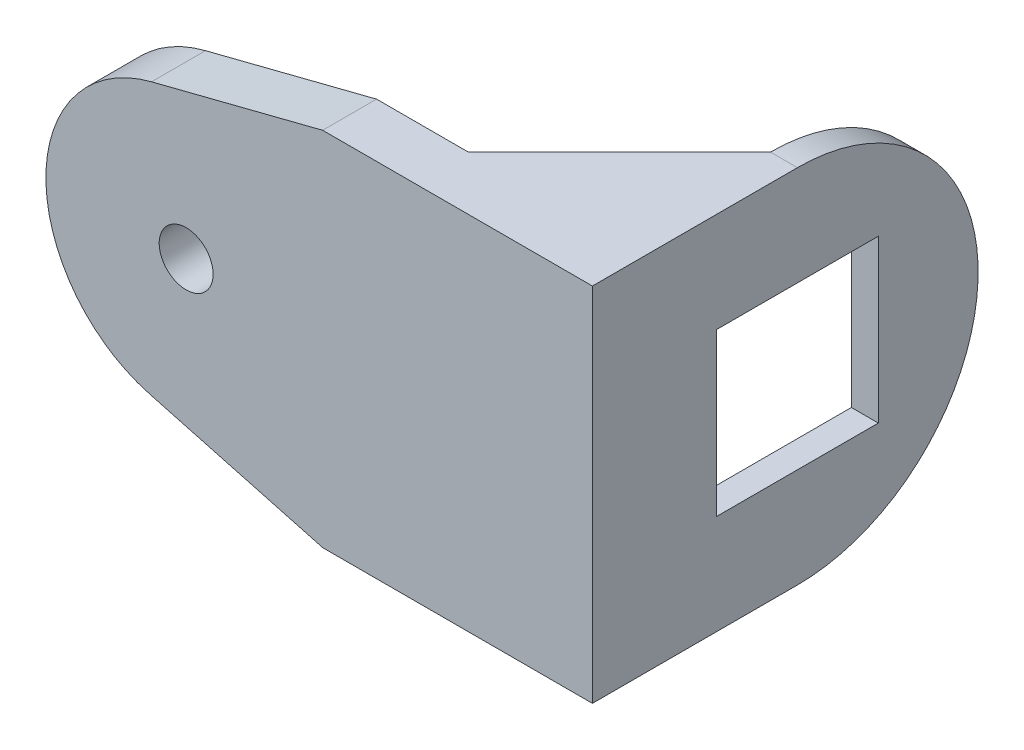
ISO-10303-21;
HEADER;
FILE_DESCRIPTION(('STEP AP214'),'2;1');
FILE_NAME('part.step','',(''),(''),'','','');
FILE_SCHEMA(('AUTOMOTIVE_DESIGN { 1 0 10303 214 1 1 1 1 }'));
ENDSEC;
DATA;
#1=APPLICATION_CONTEXT('core data for automotive mechanical design processes');
#2=APPLICATION_PROTOCOL_DEFINITION('international standard','automotive_design',2000,#1);
#3=PRODUCT_CONTEXT('',#1,'mechanical');
#4=PRODUCT('Part','Part','',(#3));
#5=PRODUCT_RELATED_PRODUCT_CATEGORY('part','',(#4));
#6=PRODUCT_DEFINITION_FORMATION('','',#4);
#7=PRODUCT_DEFINITION_CONTEXT('part definition',#1,'design');
#8=PRODUCT_DEFINITION('design','',#6,#7);
#9=PRODUCT_DEFINITION_SHAPE('','',#8);
#10=(LENGTH_UNIT() NAMED_UNIT(*) SI_UNIT(.MILLI.,.METRE.));
#11=(NAMED_UNIT(*) PLANE_ANGLE_UNIT() SI_UNIT($,.RADIAN.));
#12=(NAMED_UNIT(*) SI_UNIT($,.STERADIAN.) SOLID_ANGLE_UNIT());
#13=UNCERTAINTY_MEASURE_WITH_UNIT(LENGTH_MEASURE(1.E-05),#10,'distance_accuracy_value','');
#14=(GEOMETRIC_REPRESENTATION_CONTEXT(3) GLOBAL_UNCERTAINTY_ASSIGNED_CONTEXT((#13)) GLOBAL_UNIT_ASSIGNED_CONTEXT((#10,
#11,#12)) REPRESENTATION_CONTEXT('',''));
#15=CARTESIAN_POINT('',(0.,0.,0.));
#16=DIRECTION('',(0.,0.,1.));
#17=DIRECTION('',(1.,0.,0.));
#18=AXIS2_PLACEMENT_3D('',#15,#16,#17);
#19=CARTESIAN_POINT('',(0.,0.,0.));
#20=DIRECTION('',(0.,0.,-1.));
#21=DIRECTION('',(-1.,0.,0.));
#22=AXIS2_PLACEMENT_3D('',#19,#20,#21);
#23=PLANE('',#22);
#24=CARTESIAN_POINT('',(0.,0.,0.));
#25=DIRECTION('',(0.,0.,1.));
#26=DIRECTION('',(1.,0.,0.));
#27=AXIS2_PLACEMENT_3D('',#24,#25,#26);
#28=CIRCLE('',#27,5.);
#29=CARTESIAN_POINT('',(5.,0.,0.));
#30=VERTEX_POINT('',#29);
#31=EDGE_CURVE('E256',#30,#30,#28,.T.);
#32=ORIENTED_EDGE('',*,*,#31,.T.);
#33=EDGE_LOOP('',(#32));
#34=FACE_BOUND('',#33,.T.);
#35=DIRECTION('',(-1.,0.,0.));
#36=VECTOR('',#35,1.);
#37=CARTESIAN_POINT('',(25.3048516922266,33.27511008462,0.));
#38=LINE('',#37,#36);
#39=CARTESIAN_POINT('',(42.3048516922262,33.27511008462,0.));
#40=VERTEX_POINT('',#39);
#41=CARTESIAN_POINT('',(25.3048516922266,33.27511008462,0.));
#42=VERTEX_POINT('',#41);
#43=EDGE_CURVE('E68',#40,#42,#38,.T.);
#44=ORIENTED_EDGE('',*,*,#43,.F.);
#45=DIRECTION('',(0.,1.,0.));
#46=VECTOR('',#45,1.);
#47=CARTESIAN_POINT('',(42.3048516922262,28.27511008462,0.));
#48=LINE('',#47,#46);
#49=CARTESIAN_POINT('',(42.3048516922262,28.27511008462,0.));
#50=VERTEX_POINT('',#49);
#51=EDGE_CURVE('E63',#50,#40,#48,.T.);
#52=ORIENTED_EDGE('',*,*,#51,.F.);
#53=DIRECTION('',(-1.,0.,0.));
#54=VECTOR('',#53,1.);
#55=CARTESIAN_POINT('',(42.3048516922262,28.27511008462,0.));
#56=LINE('',#55,#54);
#57=CARTESIAN_POINT('',(70.3048516922265,28.2751100846201,0.));
#58=VERTEX_POINT('',#57);
#59=EDGE_CURVE('E186',#58,#50,#56,.T.);
#60=ORIENTED_EDGE('',*,*,#59,.F.);
#61=DIRECTION('',(0.,1.,0.));
#62=VECTOR('',#61,1.);
#63=CARTESIAN_POINT('',(70.3048516922265,0.,0.));
#64=LINE('',#63,#62);
#65=CARTESIAN_POINT('',(70.3048516922265,-28.72488991538,0.));
#66=VERTEX_POINT('',#65);
#67=EDGE_CURVE('E164',#66,#58,#64,.T.);
#68=ORIENTED_EDGE('',*,*,#67,.F.);
#69=DIRECTION('',(-1.,0.,0.));
#70=VECTOR('',#69,1.);
#71=CARTESIAN_POINT('',(42.3048516922262,-28.72488991538,0.));
#72=LINE('',#71,#70);
#73=CARTESIAN_POINT('',(42.3048516922262,-28.72488991538,0.));
#74=VERTEX_POINT('',#73);
#75=EDGE_CURVE('E203',#66,#74,#72,.T.);
#76=ORIENTED_EDGE('',*,*,#75,.T.);
#77=DIRECTION('',(0.,-1.,0.));
#78=VECTOR('',#77,1.);
#79=CARTESIAN_POINT('',(42.3048516922262,-28.72488991538,0.));
#80=LINE('',#79,#78);
#81=CARTESIAN_POINT('',(42.3048516922262,-33.72488991538,0.));
#82=VERTEX_POINT('',#81);
#83=EDGE_CURVE('E210',#74,#82,#80,.T.);
#84=ORIENTED_EDGE('',*,*,#83,.T.);
#85=DIRECTION('',(1.,0.,0.));
#86=VECTOR('',#85,1.);
#87=CARTESIAN_POINT('',(75.3048516922266,-33.72488991538,0.));
#88=LINE('',#87,#86);
#89=CARTESIAN_POINT('',(25.3048516922266,-33.72488991538,0.));
#90=VERTEX_POINT('',#89);
#91=EDGE_CURVE('E281',#90,#82,#88,.T.);
#92=ORIENTED_EDGE('',*,*,#91,.F.);
#93=DIRECTION('',(0.965719875374785,-0.259586444765727,0.));
#94=VECTOR('',#93,1.);
#95=CARTESIAN_POINT('',(25.3048516922266,-33.72488991538,0.));
#96=LINE('',#95,#94);
#97=CARTESIAN_POINT('',(-6.74924756390891,-25.1087167597444,0.));
#98=VERTEX_POINT('',#97);
#99=EDGE_CURVE('E305',#98,#90,#96,.T.);
#100=ORIENTED_EDGE('',*,*,#99,.F.);
#101=CARTESIAN_POINT('',(0.,0.,0.));
#102=DIRECTION('',(0.,0.,1.));
#103=DIRECTION('',(-1.,0.,0.));
#104=AXIS2_PLACEMENT_3D('',#101,#102,#103);
#105=CIRCLE('',#104,26.);
#106=CARTESIAN_POINT('',(-6.41722716906485,25.1956185766616,0.));
#107=VERTEX_POINT('',#106);
#108=EDGE_CURVE('E302',#107,#98,#105,.T.);
#109=ORIENTED_EDGE('',*,*,#108,.F.);
#110=DIRECTION('',(-0.969062252948524,-0.246816429579418,0.));
#111=VECTOR('',#110,1.);
#112=CARTESIAN_POINT('',(-6.41722716906485,25.1956185766616,0.));
#113=LINE('',#112,#111);
#114=EDGE_CURVE('E299',#42,#107,#113,.T.);
#115=ORIENTED_EDGE('',*,*,#114,.F.);
#116=EDGE_LOOP('',(#44,#52,#60,#68,#76,#84,#92,#100,#109,#115));
#117=FACE_BOUND('',#116,.T.);
#118=ADVANCED_FACE('F47',(#34,#117),#23,.T.);
#119=CARTESIAN_POINT('',(70.3048516922265,0.,0.));
#120=DIRECTION('',(1.,0.,0.));
#121=DIRECTION('',(0.,1.,0.));
#122=AXIS2_PLACEMENT_3D('',#119,#120,#121);
#123=PLANE('',#122);
#124=DIRECTION('',(0.,0.,1.));
#125=VECTOR('',#124,1.);
#126=CARTESIAN_POINT('',(70.3048516922265,-15.22488991538,0.));
#127=LINE('',#126,#125);
#128=CARTESIAN_POINT('',(70.3048516922265,-15.22488991538,-43.));
#129=VERTEX_POINT('',#128);
#130=CARTESIAN_POINT('',(70.3048516922265,-15.22488991538,-13.));
#131=VERTEX_POINT('',#130);
#132=EDGE_CURVE('E222',#129,#131,#127,.T.);
#133=ORIENTED_EDGE('',*,*,#132,.F.);
#134=DIRECTION('',(0.,1.,0.));
#135=VECTOR('',#134,1.);
#136=CARTESIAN_POINT('',(70.3048516922265,0.,-43.));
#137=LINE('',#136,#135);
#138=CARTESIAN_POINT('',(70.3048516922265,14.77511008462,-43.));
#139=VERTEX_POINT('',#138);
#140=EDGE_CURVE('E174',#129,#139,#137,.T.);
#141=ORIENTED_EDGE('',*,*,#140,.T.);
#142=DIRECTION('',(0.,0.,1.));
#143=VECTOR('',#142,1.);
#144=CARTESIAN_POINT('',(70.3048516922265,14.77511008462,0.));
#145=LINE('',#144,#143);
#146=CARTESIAN_POINT('',(70.3048516922265,14.77511008462,-13.));
#147=VERTEX_POINT('',#146);
#148=EDGE_CURVE('E230',#139,#147,#145,.T.);
#149=ORIENTED_EDGE('',*,*,#148,.T.);
#150=DIRECTION('',(0.,1.,0.));
#151=VECTOR('',#150,1.);
#152=CARTESIAN_POINT('',(70.3048516922265,0.,-13.));
#153=LINE('',#152,#151);
#154=EDGE_CURVE('E226',#131,#147,#153,.T.);
#155=ORIENTED_EDGE('',*,*,#154,.F.);
#156=EDGE_LOOP('',(#133,#141,#149,#155));
#157=FACE_BOUND('',#156,.T.);
#158=DIRECTION('',(0.,1.,0.));
#159=VECTOR('',#158,1.);
#160=CARTESIAN_POINT('',(70.3048516922265,28.27511008462,-28.));
#161=LINE('',#160,#159);
#162=CARTESIAN_POINT('',(70.3048516922265,28.2751100846201,-28.));
#163=VERTEX_POINT('',#162);
#164=CARTESIAN_POINT('',(70.3048516922265,33.2751100846201,-28.));
#165=VERTEX_POINT('',#164);
#166=EDGE_CURVE('E177',#163,#165,#161,.T.);
#167=ORIENTED_EDGE('',*,*,#166,.T.);
#168=CARTESIAN_POINT('',(70.3048516922265,-0.224889915379958,-28.));
#169=DIRECTION('',(1.,0.,0.));
#170=DIRECTION('',(0.,1.,0.));
#171=AXIS2_PLACEMENT_3D('',#168,#169,#170);
#172=CIRCLE('',#171,33.5);
#173=CARTESIAN_POINT('',(70.3048516922265,-33.72488991538,-28.));
#174=VERTEX_POINT('',#173);
#175=EDGE_CURVE('E152',#165,#174,#172,.F.);
#176=ORIENTED_EDGE('',*,*,#175,.T.);
#177=DIRECTION('',(0.,-1.,0.));
#178=VECTOR('',#177,1.);
#179=CARTESIAN_POINT('',(70.3048516922265,-28.72488991538,-28.));
#180=LINE('',#179,#178);
#181=CARTESIAN_POINT('',(70.3048516922265,-28.72488991538,-28.));
#182=VERTEX_POINT('',#181);
#183=EDGE_CURVE('E214',#182,#174,#180,.T.);
#184=ORIENTED_EDGE('',*,*,#183,.F.);
#185=DIRECTION('',(0.,0.,1.));
#186=VECTOR('',#185,1.);
#187=CARTESIAN_POINT('',(70.3048516922265,-28.72488991538,0.));
#188=LINE('',#187,#186);
#189=EDGE_CURVE('E200',#182,#66,#188,.T.);
#190=ORIENTED_EDGE('',*,*,#189,.T.);
#191=ORIENTED_EDGE('',*,*,#67,.T.);
#192=DIRECTION('',(0.,0.,1.));
#193=VECTOR('',#192,1.);
#194=CARTESIAN_POINT('',(70.3048516922265,28.27511008462,0.));
#195=LINE('',#194,#193);
#196=EDGE_CURVE('E181',#163,#58,#195,.T.);
#197=ORIENTED_EDGE('',*,*,#196,.F.);
#198=EDGE_LOOP('',(#167,#176,#184,#190,#191,#197));
#199=FACE_BOUND('',#198,.T.);
#200=ADVANCED_FACE('F178',(#157,#199),#123,.F.);
#201=CARTESIAN_POINT('',(0.,0.,10.));
#202=DIRECTION('',(0.,0.,-1.));
#203=DIRECTION('',(-1.,0.,0.));
#204=AXIS2_PLACEMENT_3D('',#201,#202,#203);
#205=PLANE('',#204);
#206=DIRECTION('',(0.,1.,0.));
#207=VECTOR('',#206,1.);
#208=CARTESIAN_POINT('',(75.3048516922265,33.27511008462,10.));
#209=LINE('',#208,#207);
#210=CARTESIAN_POINT('',(75.3048516922266,-33.72488991538,10.));
#211=VERTEX_POINT('',#210);
#212=CARTESIAN_POINT('',(75.3048516922265,33.27511008462,10.));
#213=VERTEX_POINT('',#212);
#214=EDGE_CURVE('E276',#211,#213,#209,.T.);
#215=ORIENTED_EDGE('',*,*,#214,.T.);
#216=DIRECTION('',(-1.,0.,0.));
#217=VECTOR('',#216,1.);
#218=CARTESIAN_POINT('',(25.3048516922266,33.27511008462,10.));
#219=LINE('',#218,#217);
#220=CARTESIAN_POINT('',(25.3048516922266,33.27511008462,10.));
#221=VERTEX_POINT('',#220);
#222=EDGE_CURVE('E280',#213,#221,#219,.T.);
#223=ORIENTED_EDGE('',*,*,#222,.T.);
#224=DIRECTION('',(-0.969062252948524,-0.246816429579418,0.));
#225=VECTOR('',#224,1.);
#226=CARTESIAN_POINT('',(-6.41722716906485,25.1956185766616,10.));
#227=LINE('',#226,#225);
#228=CARTESIAN_POINT('',(-6.41722716906485,25.1956185766616,10.));
#229=VERTEX_POINT('',#228);
#230=EDGE_CURVE('E284',#221,#229,#227,.T.);
#231=ORIENTED_EDGE('',*,*,#230,.T.);
#232=CARTESIAN_POINT('',(0.,0.,10.));
#233=DIRECTION('',(0.,0.,1.));
#234=DIRECTION('',(-1.,0.,0.));
#235=AXIS2_PLACEMENT_3D('',#232,#233,#234);
#236=CIRCLE('',#235,26.);
#237=CARTESIAN_POINT('',(-6.74924756390891,-25.1087167597444,10.));
#238=VERTEX_POINT('',#237);
#239=EDGE_CURVE('E287',#229,#238,#236,.T.);
#240=ORIENTED_EDGE('',*,*,#239,.T.);
#241=DIRECTION('',(0.965719875374785,-0.259586444765727,0.));
#242=VECTOR('',#241,1.);
#243=CARTESIAN_POINT('',(25.3048516922266,-33.72488991538,10.));
#244=LINE('',#243,#242);
#245=CARTESIAN_POINT('',(25.3048516922266,-33.72488991538,10.));
#246=VERTEX_POINT('',#245);
#247=EDGE_CURVE('E290',#238,#246,#244,.T.);
#248=ORIENTED_EDGE('',*,*,#247,.T.);
#249=DIRECTION('',(1.,0.,0.));
#250=VECTOR('',#249,1.);
#251=CARTESIAN_POINT('',(75.3048516922266,-33.72488991538,10.));
#252=LINE('',#251,#250);
#253=EDGE_CURVE('E293',#246,#211,#252,.T.);
#254=ORIENTED_EDGE('',*,*,#253,.T.);
#255=EDGE_LOOP('',(#215,#223,#231,#240,#248,#254));
#256=FACE_BOUND('',#255,.T.);
#257=CARTESIAN_POINT('',(0.,0.,10.));
#258=DIRECTION('',(0.,0.,1.));
#259=DIRECTION('',(1.,0.,0.));
#260=AXIS2_PLACEMENT_3D('',#257,#258,#259);
#261=CIRCLE('',#260,5.);
#262=CARTESIAN_POINT('',(5.,0.,10.));
#263=VERTEX_POINT('',#262);
#264=EDGE_CURVE('E269',#263,#263,#261,.T.);
#265=ORIENTED_EDGE('',*,*,#264,.F.);
#266=EDGE_LOOP('',(#265));
#267=FACE_BOUND('',#266,.T.);
#268=ADVANCED_FACE('F344',(#256,#267),#205,.F.);
#269=CARTESIAN_POINT('',(75.3048516922265,33.27511008462,10.));
#270=DIRECTION('',(-1.,0.,0.));
#271=DIRECTION('',(0.,-1.,0.));
#272=AXIS2_PLACEMENT_3D('',#269,#270,#271);
#273=PLANE('',#272);
#274=DIRECTION('',(0.,0.,-1.));
#275=VECTOR('',#274,1.);
#276=CARTESIAN_POINT('',(75.3048516922266,-33.72488991538,10.));
#277=LINE('',#276,#275);
#278=CARTESIAN_POINT('',(75.3048516922265,-33.72488991538,-28.));
#279=VERTEX_POINT('',#278);
#280=EDGE_CURVE('E296',#211,#279,#277,.T.);
#281=ORIENTED_EDGE('',*,*,#280,.T.);
#282=CARTESIAN_POINT('',(75.3048516922265,-0.224889915379957,-28.));
#283=DIRECTION('',(1.,0.,0.));
#284=DIRECTION('',(0.,1.,0.));
#285=AXIS2_PLACEMENT_3D('',#282,#283,#284);
#286=CIRCLE('',#285,33.5);
#287=CARTESIAN_POINT('',(75.3048516922265,33.27511008462,-28.));
#288=VERTEX_POINT('',#287);
#289=EDGE_CURVE('E217',#288,#279,#286,.F.);
#290=ORIENTED_EDGE('',*,*,#289,.F.);
#291=DIRECTION('',(0.,0.,-1.));
#292=VECTOR('',#291,1.);
#293=CARTESIAN_POINT('',(75.3048516922265,33.27511008462,10.));
#294=LINE('',#293,#292);
#295=EDGE_CURVE('E11',#213,#288,#294,.T.);
#296=ORIENTED_EDGE('',*,*,#295,.F.);
#297=ORIENTED_EDGE('',*,*,#214,.F.);
#298=EDGE_LOOP('',(#281,#290,#296,#297));
#299=FACE_BOUND('',#298,.T.);
#300=DIRECTION('',(0.,0.,1.));
#301=VECTOR('',#300,1.);
#302=CARTESIAN_POINT('',(75.3048516922265,-15.22488991538,0.));
#303=LINE('',#302,#301);
#304=CARTESIAN_POINT('',(75.3048516922265,-15.22488991538,-43.));
#305=VERTEX_POINT('',#304);
#306=CARTESIAN_POINT('',(75.3048516922265,-15.22488991538,-13.));
#307=VERTEX_POINT('',#306);
#308=EDGE_CURVE('E238',#305,#307,#303,.T.);
#309=ORIENTED_EDGE('',*,*,#308,.T.);
#310=DIRECTION('',(0.,1.,0.));
#311=VECTOR('',#310,1.);
#312=CARTESIAN_POINT('',(75.3048516922265,0.,-13.));
#313=LINE('',#312,#311);
#314=CARTESIAN_POINT('',(75.3048516922265,14.77511008462,-13.));
#315=VERTEX_POINT('',#314);
#316=EDGE_CURVE('E242',#307,#315,#313,.T.);
#317=ORIENTED_EDGE('',*,*,#316,.T.);
#318=DIRECTION('',(0.,0.,1.));
#319=VECTOR('',#318,1.);
#320=CARTESIAN_POINT('',(75.3048516922265,14.77511008462,0.));
#321=LINE('',#320,#319);
#322=CARTESIAN_POINT('',(75.3048516922265,14.77511008462,-43.));
#323=VERTEX_POINT('',#322);
#324=EDGE_CURVE('E246',#323,#315,#321,.T.);
#325=ORIENTED_EDGE('',*,*,#324,.F.);
#326=DIRECTION('',(0.,1.,0.));
#327=VECTOR('',#326,1.);
#328=CARTESIAN_POINT('',(75.3048516922265,0.,-43.));
#329=LINE('',#328,#327);
#330=EDGE_CURVE('E165',#305,#323,#329,.T.);
#331=ORIENTED_EDGE('',*,*,#330,.F.);
#332=EDGE_LOOP('',(#309,#317,#325,#331));
#333=FACE_BOUND('',#332,.T.);
#334=ADVANCED_FACE('F49',(#299,#333),#273,.F.);
#335=CARTESIAN_POINT('',(25.3048516922266,33.27511008462,10.));
#336=DIRECTION('',(0.,-1.,0.));
#337=DIRECTION('',(0.,0.,-1.));
#338=AXIS2_PLACEMENT_3D('',#335,#336,#337);
#339=PLANE('',#338);
#340=DIRECTION('',(0.707106781186551,0.,-0.707106781186544));
#341=VECTOR('',#340,1.);
#342=CARTESIAN_POINT('',(70.3048516922265,33.2751100846201,-28.));
#343=LINE('',#342,#341);
#344=EDGE_CURVE('E171',#40,#165,#343,.T.);
#345=ORIENTED_EDGE('',*,*,#344,.F.);
#346=ORIENTED_EDGE('',*,*,#43,.T.);
#347=DIRECTION('',(0.,0.,-1.));
#348=VECTOR('',#347,1.);
#349=CARTESIAN_POINT('',(25.3048516922266,33.27511008462,10.));
#350=LINE('',#349,#348);
#351=EDGE_CURVE('E56',#221,#42,#350,.T.);
#352=ORIENTED_EDGE('',*,*,#351,.F.);
#353=ORIENTED_EDGE('',*,*,#222,.F.);
#354=ORIENTED_EDGE('',*,*,#295,.T.);
#355=DIRECTION('',(1.,0.,0.));
#356=VECTOR('',#355,1.);
#357=CARTESIAN_POINT('',(70.3048516922265,33.27511008462,-28.));
#358=LINE('',#357,#356);
#359=EDGE_CURVE('E156',#165,#288,#358,.T.);
#360=ORIENTED_EDGE('',*,*,#359,.F.);
#361=EDGE_LOOP('',(#345,#346,#352,#353,#354,#360));
#362=FACE_BOUND('',#361,.T.);
#363=ADVANCED_FACE('F169',(#362),#339,.F.);
#364=CARTESIAN_POINT('',(-6.41722716906485,25.1956185766616,10.));
#365=DIRECTION('',(0.246816429579418,-0.969062252948524,0.));
#366=DIRECTION('',(0.969062252948524,0.246816429579418,0.));
#367=AXIS2_PLACEMENT_3D('',#364,#365,#366);
#368=PLANE('',#367);
#369=ORIENTED_EDGE('',*,*,#114,.T.);
#370=DIRECTION('',(0.,0.,-1.));
#371=VECTOR('',#370,1.);
#372=CARTESIAN_POINT('',(-6.41722716906485,25.1956185766616,10.));
#373=LINE('',#372,#371);
#374=EDGE_CURVE('E321',#229,#107,#373,.T.);
#375=ORIENTED_EDGE('',*,*,#374,.F.);
#376=ORIENTED_EDGE('',*,*,#230,.F.);
#377=ORIENTED_EDGE('',*,*,#351,.T.);
#378=EDGE_LOOP('',(#369,#375,#376,#377));
#379=FACE_BOUND('',#378,.T.);
#380=ADVANCED_FACE('F329',(#379),#368,.F.);
#381=CARTESIAN_POINT('',(0.,0.,10.));
#382=DIRECTION('',(0.,0.,-1.));
#383=DIRECTION('',(-1.,0.,0.));
#384=AXIS2_PLACEMENT_3D('',#381,#382,#383);
#385=CYLINDRICAL_SURFACE('',#384,26.);
#386=ORIENTED_EDGE('',*,*,#108,.T.);
#387=DIRECTION('',(0.,0.,-1.));
#388=VECTOR('',#387,1.);
#389=CARTESIAN_POINT('',(-6.74924756390891,-25.1087167597444,10.));
#390=LINE('',#389,#388);
#391=EDGE_CURVE('E317',#238,#98,#390,.T.);
#392=ORIENTED_EDGE('',*,*,#391,.F.);
#393=ORIENTED_EDGE('',*,*,#239,.F.);
#394=ORIENTED_EDGE('',*,*,#374,.T.);
#395=EDGE_LOOP('',(#386,#392,#393,#394));
#396=FACE_BOUND('',#395,.T.);
#397=ADVANCED_FACE('F336',(#396),#385,.T.);
#398=CARTESIAN_POINT('',(25.3048516922266,-33.72488991538,10.));
#399=DIRECTION('',(0.259586444765727,0.965719875374785,0.));
#400=DIRECTION('',(-0.965719875374785,0.259586444765727,0.));
#401=AXIS2_PLACEMENT_3D('',#398,#399,#400);
#402=PLANE('',#401);
#403=ORIENTED_EDGE('',*,*,#99,.T.);
#404=DIRECTION('',(0.,0.,-1.));
#405=VECTOR('',#404,1.);
#406=CARTESIAN_POINT('',(25.3048516922266,-33.72488991538,10.));
#407=LINE('',#406,#405);
#408=EDGE_CURVE('E313',#246,#90,#407,.T.);
#409=ORIENTED_EDGE('',*,*,#408,.F.);
#410=ORIENTED_EDGE('',*,*,#247,.F.);
#411=ORIENTED_EDGE('',*,*,#391,.T.);
#412=EDGE_LOOP('',(#403,#409,#410,#411));
#413=FACE_BOUND('',#412,.T.);
#414=ADVANCED_FACE('F340',(#413),#402,.F.);
#415=CARTESIAN_POINT('',(75.3048516922266,-33.72488991538,10.));
#416=DIRECTION('',(0.,1.,0.));
#417=DIRECTION('',(-1.,0.,0.));
#418=AXIS2_PLACEMENT_3D('',#415,#416,#417);
#419=PLANE('',#418);
#420=ORIENTED_EDGE('',*,*,#91,.T.);
#421=DIRECTION('',(0.707106781186551,0.,-0.707106781186544));
#422=VECTOR('',#421,1.);
#423=CARTESIAN_POINT('',(70.3048516922265,-33.72488991538,-28.));
#424=LINE('',#423,#422);
#425=EDGE_CURVE('E198',#82,#174,#424,.T.);
#426=ORIENTED_EDGE('',*,*,#425,.T.);
#427=DIRECTION('',(1.,0.,0.));
#428=VECTOR('',#427,1.);
#429=CARTESIAN_POINT('',(70.3048516922265,-33.72488991538,-28.));
#430=LINE('',#429,#428);
#431=EDGE_CURVE('E159',#174,#279,#430,.T.);
#432=ORIENTED_EDGE('',*,*,#431,.T.);
#433=ORIENTED_EDGE('',*,*,#280,.F.);
#434=ORIENTED_EDGE('',*,*,#253,.F.);
#435=ORIENTED_EDGE('',*,*,#408,.T.);
#436=EDGE_LOOP('',(#420,#426,#432,#433,#434,#435));
#437=FACE_BOUND('',#436,.T.);
#438=ADVANCED_FACE('F351',(#437),#419,.F.);
#439=CARTESIAN_POINT('',(0.,0.,10.));
#440=DIRECTION('',(0.,0.,-1.));
#441=DIRECTION('',(-1.,0.,0.));
#442=AXIS2_PLACEMENT_3D('',#439,#440,#441);
#443=CYLINDRICAL_SURFACE('',#442,5.);
#444=ORIENTED_EDGE('',*,*,#264,.T.);
#445=EDGE_LOOP('',(#444));
#446=FACE_BOUND('',#445,.T.);
#447=ORIENTED_EDGE('',*,*,#31,.F.);
#448=EDGE_LOOP('',(#447));
#449=FACE_BOUND('',#448,.T.);
#450=ADVANCED_FACE('F386',(#446,#449),#443,.F.);
#451=CARTESIAN_POINT('',(70.3048516922265,-15.22488991538,0.));
#452=DIRECTION('',(0.,1.,0.));
#453=DIRECTION('',(-1.,0.,0.));
#454=AXIS2_PLACEMENT_3D('',#451,#452,#453);
#455=PLANE('',#454);
#456=ORIENTED_EDGE('',*,*,#308,.F.);
#457=DIRECTION('',(1.,0.,0.));
#458=VECTOR('',#457,1.);
#459=CARTESIAN_POINT('',(70.3048516922265,-15.22488991538,-43.));
#460=LINE('',#459,#458);
#461=EDGE_CURVE('E253',#129,#305,#460,.T.);
#462=ORIENTED_EDGE('',*,*,#461,.F.);
#463=ORIENTED_EDGE('',*,*,#132,.T.);
#464=DIRECTION('',(1.,0.,0.));
#465=VECTOR('',#464,1.);
#466=CARTESIAN_POINT('',(70.3048516922265,-15.22488991538,-13.));
#467=LINE('',#466,#465);
#468=EDGE_CURVE('E264',#131,#307,#467,.T.);
#469=ORIENTED_EDGE('',*,*,#468,.T.);
#470=EDGE_LOOP('',(#456,#462,#463,#469));
#471=FACE_BOUND('',#470,.T.);
#472=ADVANCED_FACE('F426',(#471),#455,.T.);
#473=CARTESIAN_POINT('',(70.3048516922265,0.,-43.));
#474=DIRECTION('',(0.,0.,-1.));
#475=DIRECTION('',(-1.,0.,0.));
#476=AXIS2_PLACEMENT_3D('',#473,#474,#475);
#477=PLANE('',#476);
#478=ORIENTED_EDGE('',*,*,#330,.T.);
#479=DIRECTION('',(1.,0.,0.));
#480=VECTOR('',#479,1.);
#481=CARTESIAN_POINT('',(70.3048516922265,14.77511008462,-43.));
#482=LINE('',#481,#480);
#483=EDGE_CURVE('E257',#139,#323,#482,.T.);
#484=ORIENTED_EDGE('',*,*,#483,.F.);
#485=ORIENTED_EDGE('',*,*,#140,.F.);
#486=ORIENTED_EDGE('',*,*,#461,.T.);
#487=EDGE_LOOP('',(#478,#484,#485,#486));
#488=FACE_BOUND('',#487,.T.);
#489=ADVANCED_FACE('F463',(#488),#477,.F.);
#490=CARTESIAN_POINT('',(70.3048516922265,14.77511008462,0.));
#491=DIRECTION('',(0.,1.,0.));
#492=DIRECTION('',(-1.,0.,0.));
#493=AXIS2_PLACEMENT_3D('',#490,#491,#492);
#494=PLANE('',#493);
#495=ORIENTED_EDGE('',*,*,#324,.T.);
#496=DIRECTION('',(1.,0.,0.));
#497=VECTOR('',#496,1.);
#498=CARTESIAN_POINT('',(70.3048516922265,14.77511008462,-13.));
#499=LINE('',#498,#497);
#500=EDGE_CURVE('E261',#147,#315,#499,.T.);
#501=ORIENTED_EDGE('',*,*,#500,.F.);
#502=ORIENTED_EDGE('',*,*,#148,.F.);
#503=ORIENTED_EDGE('',*,*,#483,.T.);
#504=EDGE_LOOP('',(#495,#501,#502,#503));
#505=FACE_BOUND('',#504,.T.);
#506=ADVANCED_FACE('F473',(#505),#494,.F.);
#507=CARTESIAN_POINT('',(70.3048516922265,-0.224889915379958,-28.));
#508=DIRECTION('',(1.,0.,0.));
#509=DIRECTION('',(0.,1.,0.));
#510=AXIS2_PLACEMENT_3D('',#507,#508,#509);
#511=CYLINDRICAL_SURFACE('',#510,33.5);
#512=ORIENTED_EDGE('',*,*,#289,.T.);
#513=ORIENTED_EDGE('',*,*,#431,.F.);
#514=ORIENTED_EDGE('',*,*,#175,.F.);
#515=ORIENTED_EDGE('',*,*,#359,.T.);
#516=EDGE_LOOP('',(#512,#513,#514,#515));
#517=FACE_BOUND('',#516,.T.);
#518=ADVANCED_FACE('F155',(#517),#511,.T.);
#519=CARTESIAN_POINT('',(70.3048516922265,0.,-13.));
#520=DIRECTION('',(0.,0.,-1.));
#521=DIRECTION('',(-1.,0.,0.));
#522=AXIS2_PLACEMENT_3D('',#519,#520,#521);
#523=PLANE('',#522);
#524=ORIENTED_EDGE('',*,*,#316,.F.);
#525=ORIENTED_EDGE('',*,*,#468,.F.);
#526=ORIENTED_EDGE('',*,*,#154,.T.);
#527=ORIENTED_EDGE('',*,*,#500,.T.);
#528=EDGE_LOOP('',(#524,#525,#526,#527));
#529=FACE_BOUND('',#528,.T.);
#530=ADVANCED_FACE('F492',(#529),#523,.T.);
#531=CARTESIAN_POINT('',(70.3048516922265,-28.72488991538,-28.));
#532=DIRECTION('',(-0.707106781186544,0.,-0.707106781186551));
#533=DIRECTION('',(-0.707106781186551,0.,0.707106781186544));
#534=AXIS2_PLACEMENT_3D('',#531,#532,#533);
#535=PLANE('',#534);
#536=ORIENTED_EDGE('',*,*,#425,.F.);
#537=ORIENTED_EDGE('',*,*,#83,.F.);
#538=DIRECTION('',(0.707106781186551,0.,-0.707106781186544));
#539=VECTOR('',#538,1.);
#540=CARTESIAN_POINT('',(70.3048516922265,-28.72488991538,-28.));
#541=LINE('',#540,#539);
#542=EDGE_CURVE('E206',#74,#182,#541,.T.);
#543=ORIENTED_EDGE('',*,*,#542,.T.);
#544=ORIENTED_EDGE('',*,*,#183,.T.);
#545=EDGE_LOOP('',(#536,#537,#543,#544));
#546=FACE_BOUND('',#545,.T.);
#547=ADVANCED_FACE('F355',(#546),#535,.T.);
#548=CARTESIAN_POINT('',(0.,-28.72488991538,0.));
#549=DIRECTION('',(0.,-1.,0.));
#550=DIRECTION('',(1.,0.,0.));
#551=AXIS2_PLACEMENT_3D('',#548,#549,#550);
#552=PLANE('',#551);
#553=ORIENTED_EDGE('',*,*,#189,.F.);
#554=ORIENTED_EDGE('',*,*,#542,.F.);
#555=ORIENTED_EDGE('',*,*,#75,.F.);
#556=EDGE_LOOP('',(#553,#554,#555));
#557=FACE_BOUND('',#556,.T.);
#558=ADVANCED_FACE('F361',(#557),#552,.F.);
#559=CARTESIAN_POINT('',(70.3048516922265,28.27511008462,-28.));
#560=DIRECTION('',(0.707106781186544,0.,0.707106781186551));
#561=DIRECTION('',(0.707106781186551,0.,-0.707106781186544));
#562=AXIS2_PLACEMENT_3D('',#559,#560,#561);
#563=PLANE('',#562);
#564=ORIENTED_EDGE('',*,*,#344,.T.);
#565=ORIENTED_EDGE('',*,*,#166,.F.);
#566=DIRECTION('',(0.707106781186551,0.,-0.707106781186544));
#567=VECTOR('',#566,1.);
#568=CARTESIAN_POINT('',(70.3048516922265,28.27511008462,-28.));
#569=LINE('',#568,#567);
#570=EDGE_CURVE('E192',#50,#163,#569,.T.);
#571=ORIENTED_EDGE('',*,*,#570,.F.);
#572=ORIENTED_EDGE('',*,*,#51,.T.);
#573=EDGE_LOOP('',(#564,#565,#571,#572));
#574=FACE_BOUND('',#573,.T.);
#575=ADVANCED_FACE('F188',(#574),#563,.F.);
#576=CARTESIAN_POINT('',(0.,28.27511008462,0.));
#577=DIRECTION('',(0.,1.,0.));
#578=DIRECTION('',(1.,0.,0.));
#579=AXIS2_PLACEMENT_3D('',#576,#577,#578);
#580=PLANE('',#579);
#581=ORIENTED_EDGE('',*,*,#196,.T.);
#582=ORIENTED_EDGE('',*,*,#59,.T.);
#583=ORIENTED_EDGE('',*,*,#570,.T.);
#584=EDGE_LOOP('',(#581,#582,#583));
#585=FACE_BOUND('',#584,.T.);
#586=ADVANCED_FACE('F363',(#585),#580,.F.);
#587=CLOSED_SHELL('',(#118,#200,#268,#334,#363,#380,#397,#414,#438,#450,#472,#489,#506,#518,
#530,#547,#558,#575,#586));
#588=MANIFOLD_SOLID_BREP('B2',#587);
#589=ADVANCED_BREP_SHAPE_REPRESENTATION('',(#18,#588),#14);
#590=SHAPE_DEFINITION_REPRESENTATION(#9,#589);
ENDSEC;
END-ISO-10303-21;
